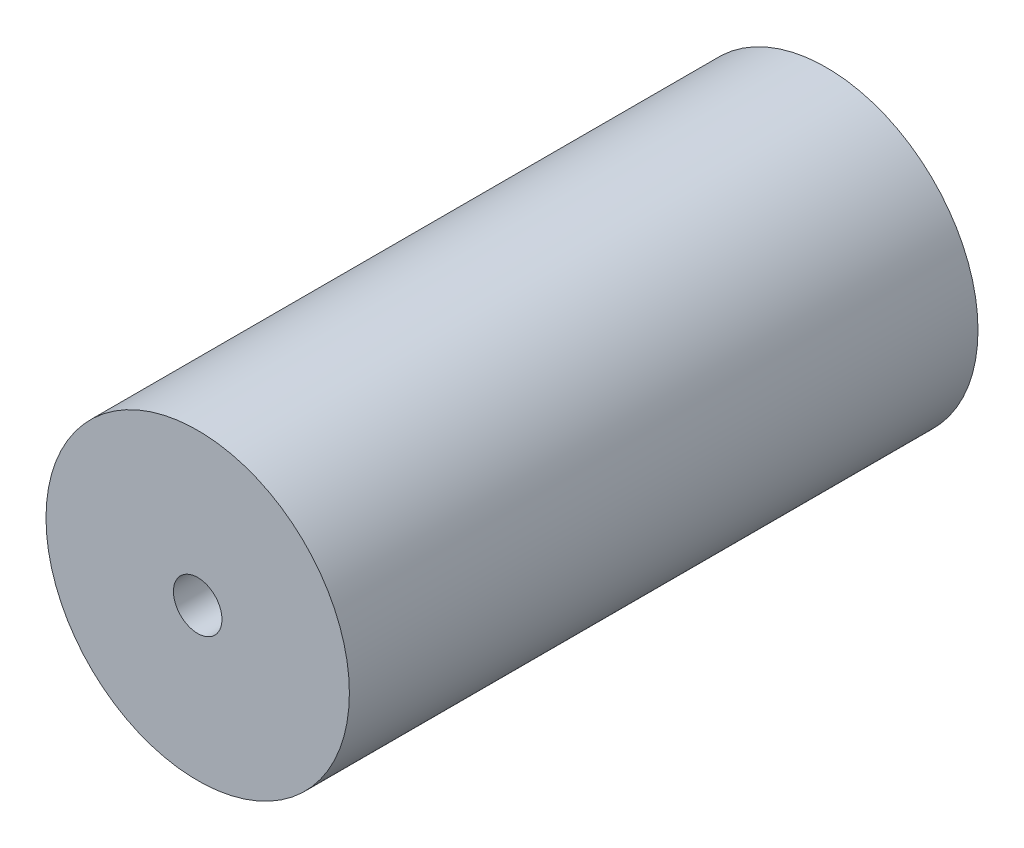
ISO-10303-21;
HEADER;
FILE_DESCRIPTION(('STEP AP214'),'2;1');
FILE_NAME('part.step','',(''),(''),'','','');
FILE_SCHEMA(('AUTOMOTIVE_DESIGN { 1 0 10303 214 1 1 1 1 }'));
ENDSEC;
DATA;
#1=APPLICATION_CONTEXT('core data for automotive mechanical design processes');
#2=APPLICATION_PROTOCOL_DEFINITION('international standard','automotive_design',2000,#1);
#3=PRODUCT_CONTEXT('',#1,'mechanical');
#4=PRODUCT('Part','Part','',(#3));
#5=PRODUCT_RELATED_PRODUCT_CATEGORY('part','',(#4));
#6=PRODUCT_DEFINITION_FORMATION('','',#4);
#7=PRODUCT_DEFINITION_CONTEXT('part definition',#1,'design');
#8=PRODUCT_DEFINITION('design','',#6,#7);
#9=PRODUCT_DEFINITION_SHAPE('','',#8);
#10=(LENGTH_UNIT() NAMED_UNIT(*) SI_UNIT(.MILLI.,.METRE.));
#11=(NAMED_UNIT(*) PLANE_ANGLE_UNIT() SI_UNIT($,.RADIAN.));
#12=(NAMED_UNIT(*) SI_UNIT($,.STERADIAN.) SOLID_ANGLE_UNIT());
#13=UNCERTAINTY_MEASURE_WITH_UNIT(LENGTH_MEASURE(1.E-05),#10,'distance_accuracy_value','');
#14=(GEOMETRIC_REPRESENTATION_CONTEXT(3) GLOBAL_UNCERTAINTY_ASSIGNED_CONTEXT((#13)) GLOBAL_UNIT_ASSIGNED_CONTEXT((#10,
#11,#12)) REPRESENTATION_CONTEXT('',''));
#15=CARTESIAN_POINT('',(0.,0.,0.));
#16=DIRECTION('',(0.,0.,1.));
#17=DIRECTION('',(1.,0.,0.));
#18=AXIS2_PLACEMENT_3D('',#15,#16,#17);
#19=CARTESIAN_POINT('',(0.,0.,51.8));
#20=DIRECTION('',(0.,0.,-1.));
#21=DIRECTION('',(-1.,0.,0.));
#22=AXIS2_PLACEMENT_3D('',#19,#20,#21);
#23=CYLINDRICAL_SURFACE('',#22,12.5);
#24=CARTESIAN_POINT('',(0.,0.,51.8));
#25=DIRECTION('',(0.,0.,1.));
#26=DIRECTION('',(1.,0.,0.));
#27=AXIS2_PLACEMENT_3D('',#24,#25,#26);
#28=CIRCLE('',#27,12.5);
#29=CARTESIAN_POINT('',(-12.5,0.,51.8));
#30=VERTEX_POINT('',#29);
#31=EDGE_CURVE('E50',#30,#30,#28,.T.);
#32=CARTESIAN_POINT('',(0.,0.,0.));
#33=DIRECTION('',(0.,0.,1.));
#34=DIRECTION('',(1.,0.,0.));
#35=AXIS2_PLACEMENT_3D('',#32,#33,#34);
#36=CIRCLE('',#35,12.5);
#37=CARTESIAN_POINT('',(-12.5,0.,0.));
#38=VERTEX_POINT('',#37);
#39=EDGE_CURVE('E46',#38,#38,#36,.T.);
#40=CARTESIAN_POINT('',(-12.5,0.,51.8));
#41=CARTESIAN_POINT('',(-12.5,0.,51.2604166666667));
#42=CARTESIAN_POINT('',(-12.5,0.,50.7208333333333));
#43=CARTESIAN_POINT('',(-12.5,0.,49.6416666666667));
#44=CARTESIAN_POINT('',(-12.5,0.,49.1020833333333));
#45=CARTESIAN_POINT('',(-12.5,0.,48.0229166666667));
#46=CARTESIAN_POINT('',(-12.5,0.,47.4833333333333));
#47=CARTESIAN_POINT('',(-12.5,0.,46.4041666666667));
#48=CARTESIAN_POINT('',(-12.5,0.,45.8645833333333));
#49=CARTESIAN_POINT('',(-12.5,0.,44.7854166666667));
#50=CARTESIAN_POINT('',(-12.5,0.,44.2458333333333));
#51=CARTESIAN_POINT('',(-12.5,0.,43.1666666666667));
#52=CARTESIAN_POINT('',(-12.5,0.,42.6270833333333));
#53=CARTESIAN_POINT('',(-12.5,0.,41.5479166666667));
#54=CARTESIAN_POINT('',(-12.5,0.,41.0083333333333));
#55=CARTESIAN_POINT('',(-12.5,0.,39.9291666666667));
#56=CARTESIAN_POINT('',(-12.5,0.,39.3895833333333));
#57=CARTESIAN_POINT('',(-12.5,0.,38.3104166666667));
#58=CARTESIAN_POINT('',(-12.5,0.,37.7708333333333));
#59=CARTESIAN_POINT('',(-12.5,0.,36.6916666666667));
#60=CARTESIAN_POINT('',(-12.5,0.,36.1520833333333));
#61=CARTESIAN_POINT('',(-12.5,0.,35.0729166666667));
#62=CARTESIAN_POINT('',(-12.5,0.,34.5333333333333));
#63=CARTESIAN_POINT('',(-12.5,0.,33.4541666666667));
#64=CARTESIAN_POINT('',(-12.5,0.,32.9145833333333));
#65=CARTESIAN_POINT('',(-12.5,0.,31.8354166666667));
#66=CARTESIAN_POINT('',(-12.5,0.,31.2958333333333));
#67=CARTESIAN_POINT('',(-12.5,0.,30.2166666666667));
#68=CARTESIAN_POINT('',(-12.5,0.,29.6770833333333));
#69=CARTESIAN_POINT('',(-12.5,0.,28.5979166666667));
#70=CARTESIAN_POINT('',(-12.5,0.,28.0583333333333));
#71=CARTESIAN_POINT('',(-12.5,0.,26.9791666666667));
#72=CARTESIAN_POINT('',(-12.5,0.,26.4395833333333));
#73=CARTESIAN_POINT('',(-12.5,0.,25.3604166666667));
#74=CARTESIAN_POINT('',(-12.5,0.,24.8208333333333));
#75=CARTESIAN_POINT('',(-12.5,0.,23.7416666666667));
#76=CARTESIAN_POINT('',(-12.5,0.,23.2020833333333));
#77=CARTESIAN_POINT('',(-12.5,0.,22.1229166666667));
#78=CARTESIAN_POINT('',(-12.5,0.,21.5833333333333));
#79=CARTESIAN_POINT('',(-12.5,0.,20.5041666666667));
#80=CARTESIAN_POINT('',(-12.5,0.,19.9645833333333));
#81=CARTESIAN_POINT('',(-12.5,0.,18.8854166666667));
#82=CARTESIAN_POINT('',(-12.5,0.,18.3458333333333));
#83=CARTESIAN_POINT('',(-12.5,0.,17.2666666666667));
#84=CARTESIAN_POINT('',(-12.5,0.,16.7270833333333));
#85=CARTESIAN_POINT('',(-12.5,0.,15.6479166666667));
#86=CARTESIAN_POINT('',(-12.5,0.,15.1083333333333));
#87=CARTESIAN_POINT('',(-12.5,0.,14.0291666666667));
#88=CARTESIAN_POINT('',(-12.5,0.,13.4895833333333));
#89=CARTESIAN_POINT('',(-12.5,0.,12.4104166666667));
#90=CARTESIAN_POINT('',(-12.5,0.,11.8708333333333));
#91=CARTESIAN_POINT('',(-12.5,0.,10.7916666666667));
#92=CARTESIAN_POINT('',(-12.5,0.,10.2520833333333));
#93=CARTESIAN_POINT('',(-12.5,0.,9.17291666666666));
#94=CARTESIAN_POINT('',(-12.5,0.,8.63333333333333));
#95=CARTESIAN_POINT('',(-12.5,0.,7.55416666666666));
#96=CARTESIAN_POINT('',(-12.5,0.,7.01458333333333));
#97=CARTESIAN_POINT('',(-12.5,0.,5.93541666666666));
#98=CARTESIAN_POINT('',(-12.5,0.,5.39583333333333));
#99=CARTESIAN_POINT('',(-12.5,0.,4.31666666666666));
#100=CARTESIAN_POINT('',(-12.5,0.,3.77708333333332));
#101=CARTESIAN_POINT('',(-12.5,0.,2.69791666666666));
#102=CARTESIAN_POINT('',(-12.5,0.,2.15833333333333));
#103=CARTESIAN_POINT('',(-12.5,0.,1.07916666666666));
#104=CARTESIAN_POINT('',(-12.5,0.,0.539583333333327));
#105=CARTESIAN_POINT('',(-12.5,0.,0.));
#106=B_SPLINE_CURVE_WITH_KNOTS('',3,(#40,#41,#42,#43,#44,#45,#46,#47,#48,#49,#50,#51,#52,#53,
#54,#55,#56,#57,#58,#59,#60,#61,#62,#63,#64,#65,#66,#67,#68,#69,#70,#71,#72,#73,#74,#75,#76,#77,
#78,#79,#80,#81,#82,#83,#84,#85,#86,#87,#88,#89,#90,#91,#92,#93,#94,#95,#96,#97,#98,#99,#100,
#101,#102,#103,#104,#105),.UNSPECIFIED.,.F.,.F.,(4,2,2,2,2,2,2,2,2,2,2,2,2,2,2,2,2,2,2,2,2,2,2,
2,2,2,2,2,2,2,2,2,4),(0.,1.61875,3.2375,4.85625,6.47499999999999,8.09375,9.71249999999999,
11.33125,12.95,14.56875,16.1875,17.80625,19.425,21.04375,22.6625,24.28125,25.9,27.51875,29.1375,
30.75625,32.375,33.99375,35.6125,37.23125,38.85,40.46875,42.0875,43.70625,45.325,46.94375,
48.5625,50.18125,51.8),.UNSPECIFIED.);
#107=EDGE_CURVE('BSEAM43',#30,#38,#106,.T.);
#108=ORIENTED_EDGE('',*,*,#31,.F.);
#109=ORIENTED_EDGE('',*,*,#39,.T.);
#110=ORIENTED_EDGE('',*,*,#107,.T.);
#111=ORIENTED_EDGE('',*,*,#107,.F.);
#112=EDGE_LOOP('',(#108,#110,#109,#111));
#113=FACE_BOUND('',#112,.T.);
#114=ADVANCED_FACE('F43',(#113),#23,.T.);
#115=CARTESIAN_POINT('',(0.,0.,51.8));
#116=DIRECTION('',(0.,0.,1.));
#117=DIRECTION('',(1.,0.,0.));
#118=AXIS2_PLACEMENT_3D('',#115,#116,#117);
#119=PLANE('',#118);
#120=CARTESIAN_POINT('',(0.,0.,51.8));
#121=DIRECTION('',(0.,0.,-1.));
#122=DIRECTION('',(-1.,0.,0.));
#123=AXIS2_PLACEMENT_3D('',#120,#121,#122);
#124=CIRCLE('',#123,2.);
#125=CARTESIAN_POINT('',(-2.,0.,51.8));
#126=VERTEX_POINT('',#125);
#127=EDGE_CURVE('E64',#126,#126,#124,.T.);
#128=ORIENTED_EDGE('',*,*,#127,.T.);
#129=EDGE_LOOP('',(#128));
#130=FACE_BOUND('',#129,.T.);
#131=ORIENTED_EDGE('',*,*,#31,.T.);
#132=EDGE_LOOP('',(#131));
#133=FACE_BOUND('',#132,.T.);
#134=ADVANCED_FACE('F78',(#130,#133),#119,.T.);
#135=CARTESIAN_POINT('',(0.,0.,0.));
#136=DIRECTION('',(0.,0.,1.));
#137=DIRECTION('',(1.,0.,0.));
#138=AXIS2_PLACEMENT_3D('',#135,#136,#137);
#139=PLANE('',#138);
#140=CARTESIAN_POINT('',(-8.5,0.,0.));
#141=DIRECTION('',(0.,0.,-1.));
#142=DIRECTION('',(-1.,0.,0.));
#143=AXIS2_PLACEMENT_3D('',#140,#141,#142);
#144=CIRCLE('',#143,1.5);
#145=CARTESIAN_POINT('',(-10.,0.,0.));
#146=VERTEX_POINT('',#145);
#147=EDGE_CURVE('E67',#146,#146,#144,.T.);
#148=ORIENTED_EDGE('',*,*,#147,.F.);
#149=EDGE_LOOP('',(#148));
#150=FACE_BOUND('',#149,.T.);
#151=CARTESIAN_POINT('',(8.5,0.,0.));
#152=DIRECTION('',(0.,0.,-1.));
#153=DIRECTION('',(-1.,0.,0.));
#154=AXIS2_PLACEMENT_3D('',#151,#152,#153);
#155=CIRCLE('',#154,1.5);
#156=CARTESIAN_POINT('',(7.,0.,0.));
#157=VERTEX_POINT('',#156);
#158=EDGE_CURVE('E63',#157,#157,#155,.T.);
#159=ORIENTED_EDGE('',*,*,#158,.F.);
#160=EDGE_LOOP('',(#159));
#161=FACE_BOUND('',#160,.T.);
#162=CARTESIAN_POINT('',(0.,0.,0.));
#163=DIRECTION('',(0.,0.,-1.));
#164=DIRECTION('',(-1.,0.,0.));
#165=AXIS2_PLACEMENT_3D('',#162,#163,#164);
#166=CIRCLE('',#165,3.5);
#167=CARTESIAN_POINT('',(-3.5,0.,0.));
#168=VERTEX_POINT('',#167);
#169=EDGE_CURVE('E10',#168,#168,#166,.T.);
#170=ORIENTED_EDGE('',*,*,#169,.F.);
#171=EDGE_LOOP('',(#170));
#172=FACE_BOUND('',#171,.T.);
#173=ORIENTED_EDGE('',*,*,#39,.F.);
#174=EDGE_LOOP('',(#173));
#175=FACE_BOUND('',#174,.T.);
#176=ADVANCED_FACE('F97',(#150,#161,#172,#175),#139,.F.);
#177=CARTESIAN_POINT('',(0.,0.,-2.38));
#178=DIRECTION('',(0.,0.,1.));
#179=DIRECTION('',(1.,0.,0.));
#180=AXIS2_PLACEMENT_3D('',#177,#178,#179);
#181=CYLINDRICAL_SURFACE('',#180,3.5);
#182=CARTESIAN_POINT('',(0.,0.,-2.38));
#183=DIRECTION('',(0.,0.,-1.));
#184=DIRECTION('',(-1.,0.,0.));
#185=AXIS2_PLACEMENT_3D('',#182,#183,#184);
#186=CIRCLE('',#185,3.5);
#187=CARTESIAN_POINT('',(-3.5,0.,-2.38));
#188=VERTEX_POINT('',#187);
#189=EDGE_CURVE('E56',#188,#188,#186,.T.);
#190=ORIENTED_EDGE('',*,*,#189,.F.);
#191=EDGE_LOOP('',(#190));
#192=FACE_BOUND('',#191,.T.);
#193=ORIENTED_EDGE('',*,*,#169,.T.);
#194=EDGE_LOOP('',(#193));
#195=FACE_BOUND('',#194,.T.);
#196=ADVANCED_FACE('F92',(#192,#195),#181,.T.);
#197=CARTESIAN_POINT('',(0.,0.,-2.38));
#198=DIRECTION('',(0.,0.,-1.));
#199=DIRECTION('',(-1.,0.,0.));
#200=AXIS2_PLACEMENT_3D('',#197,#198,#199);
#201=PLANE('',#200);
#202=CARTESIAN_POINT('',(0.,0.,-2.38));
#203=DIRECTION('',(0.,0.,-1.));
#204=DIRECTION('',(-1.,0.,0.));
#205=AXIS2_PLACEMENT_3D('',#202,#203,#204);
#206=CIRCLE('',#205,2.);
#207=CARTESIAN_POINT('',(-2.,0.,-2.38));
#208=VERTEX_POINT('',#207);
#209=EDGE_CURVE('E72',#208,#208,#206,.T.);
#210=ORIENTED_EDGE('',*,*,#209,.F.);
#211=EDGE_LOOP('',(#210));
#212=FACE_BOUND('',#211,.T.);
#213=ORIENTED_EDGE('',*,*,#189,.T.);
#214=EDGE_LOOP('',(#213));
#215=FACE_BOUND('',#214,.T.);
#216=ADVANCED_FACE('F88',(#212,#215),#201,.T.);
#217=CARTESIAN_POINT('',(8.5,0.,5.));
#218=DIRECTION('',(0.,0.,-1.));
#219=DIRECTION('',(-1.,0.,0.));
#220=AXIS2_PLACEMENT_3D('',#217,#218,#219);
#221=CYLINDRICAL_SURFACE('',#220,1.5);
#222=CARTESIAN_POINT('',(8.5,0.,5.));
#223=DIRECTION('',(0.,0.,-1.));
#224=DIRECTION('',(-1.,0.,0.));
#225=AXIS2_PLACEMENT_3D('',#222,#223,#224);
#226=CIRCLE('',#225,1.5);
#227=CARTESIAN_POINT('',(7.,0.,5.));
#228=VERTEX_POINT('',#227);
#229=EDGE_CURVE('E60',#228,#228,#226,.T.);
#230=ORIENTED_EDGE('',*,*,#229,.F.);
#231=EDGE_LOOP('',(#230));
#232=FACE_BOUND('',#231,.T.);
#233=ORIENTED_EDGE('',*,*,#158,.T.);
#234=EDGE_LOOP('',(#233));
#235=FACE_BOUND('',#234,.T.);
#236=ADVANCED_FACE('F91',(#232,#235),#221,.F.);
#237=CARTESIAN_POINT('',(8.5,0.,5.));
#238=DIRECTION('',(0.,0.,-1.));
#239=DIRECTION('',(-1.,0.,0.));
#240=AXIS2_PLACEMENT_3D('',#237,#238,#239);
#241=PLANE('',#240);
#242=ORIENTED_EDGE('',*,*,#229,.T.);
#243=EDGE_LOOP('',(#242));
#244=FACE_BOUND('',#243,.T.);
#245=ADVANCED_FACE('F148',(#244),#241,.T.);
#246=CARTESIAN_POINT('',(-8.5,0.,5.));
#247=DIRECTION('',(0.,0.,-1.));
#248=DIRECTION('',(-1.,0.,0.));
#249=AXIS2_PLACEMENT_3D('',#246,#247,#248);
#250=CYLINDRICAL_SURFACE('',#249,1.5);
#251=CARTESIAN_POINT('',(-8.5,0.,5.));
#252=DIRECTION('',(0.,0.,-1.));
#253=DIRECTION('',(-1.,0.,0.));
#254=AXIS2_PLACEMENT_3D('',#251,#252,#253);
#255=CIRCLE('',#254,1.5);
#256=CARTESIAN_POINT('',(-10.,0.,5.));
#257=VERTEX_POINT('',#256);
#258=EDGE_CURVE('E59',#257,#257,#255,.T.);
#259=ORIENTED_EDGE('',*,*,#258,.F.);
#260=EDGE_LOOP('',(#259));
#261=FACE_BOUND('',#260,.T.);
#262=ORIENTED_EDGE('',*,*,#147,.T.);
#263=EDGE_LOOP('',(#262));
#264=FACE_BOUND('',#263,.T.);
#265=ADVANCED_FACE('F140',(#261,#264),#250,.F.);
#266=CARTESIAN_POINT('',(-8.5,0.,5.));
#267=DIRECTION('',(0.,0.,-1.));
#268=DIRECTION('',(-1.,0.,0.));
#269=AXIS2_PLACEMENT_3D('',#266,#267,#268);
#270=PLANE('',#269);
#271=ORIENTED_EDGE('',*,*,#258,.T.);
#272=EDGE_LOOP('',(#271));
#273=FACE_BOUND('',#272,.T.);
#274=ADVANCED_FACE('F84',(#273),#270,.T.);
#275=CARTESIAN_POINT('',(0.,0.,51.8));
#276=DIRECTION('',(0.,0.,-1.));
#277=DIRECTION('',(-1.,0.,0.));
#278=AXIS2_PLACEMENT_3D('',#275,#276,#277);
#279=CYLINDRICAL_SURFACE('',#278,2.);
#280=CARTESIAN_POINT('',(-2.,0.,51.8));
#281=CARTESIAN_POINT('',(-2.,0.,51.235625));
#282=CARTESIAN_POINT('',(-2.,0.,50.67125));
#283=CARTESIAN_POINT('',(-2.,0.,49.5425));
#284=CARTESIAN_POINT('',(-2.,0.,48.978125));
#285=CARTESIAN_POINT('',(-2.,0.,47.849375));
#286=CARTESIAN_POINT('',(-2.,0.,47.285));
#287=CARTESIAN_POINT('',(-2.,0.,46.15625));
#288=CARTESIAN_POINT('',(-2.,0.,45.591875));
#289=CARTESIAN_POINT('',(-2.,0.,44.463125));
#290=CARTESIAN_POINT('',(-2.,0.,43.89875));
#291=CARTESIAN_POINT('',(-2.,0.,42.77));
#292=CARTESIAN_POINT('',(-2.,0.,42.205625));
#293=CARTESIAN_POINT('',(-2.,0.,41.076875));
#294=CARTESIAN_POINT('',(-2.,0.,40.5125));
#295=CARTESIAN_POINT('',(-2.,0.,39.38375));
#296=CARTESIAN_POINT('',(-2.,0.,38.819375));
#297=CARTESIAN_POINT('',(-2.,0.,37.690625));
#298=CARTESIAN_POINT('',(-2.,0.,37.12625));
#299=CARTESIAN_POINT('',(-2.,0.,35.9975));
#300=CARTESIAN_POINT('',(-2.,0.,35.433125));
#301=CARTESIAN_POINT('',(-2.,0.,34.304375));
#302=CARTESIAN_POINT('',(-2.,0.,33.74));
#303=CARTESIAN_POINT('',(-2.,0.,32.61125));
#304=CARTESIAN_POINT('',(-2.,0.,32.046875));
#305=CARTESIAN_POINT('',(-2.,0.,30.918125));
#306=CARTESIAN_POINT('',(-2.,0.,30.35375));
#307=CARTESIAN_POINT('',(-2.,0.,29.225));
#308=CARTESIAN_POINT('',(-2.,0.,28.660625));
#309=CARTESIAN_POINT('',(-2.,0.,27.531875));
#310=CARTESIAN_POINT('',(-2.,0.,26.9675));
#311=CARTESIAN_POINT('',(-2.,0.,25.83875));
#312=CARTESIAN_POINT('',(-2.,0.,25.274375));
#313=CARTESIAN_POINT('',(-2.,0.,24.145625));
#314=CARTESIAN_POINT('',(-2.,0.,23.58125));
#315=CARTESIAN_POINT('',(-2.,0.,22.4525));
#316=CARTESIAN_POINT('',(-2.,0.,21.888125));
#317=CARTESIAN_POINT('',(-2.,0.,20.759375));
#318=CARTESIAN_POINT('',(-2.,0.,20.195));
#319=CARTESIAN_POINT('',(-2.,0.,19.06625));
#320=CARTESIAN_POINT('',(-2.,0.,18.501875));
#321=CARTESIAN_POINT('',(-2.,0.,17.373125));
#322=CARTESIAN_POINT('',(-2.,0.,16.80875));
#323=CARTESIAN_POINT('',(-2.,0.,15.68));
#324=CARTESIAN_POINT('',(-2.,0.,15.115625));
#325=CARTESIAN_POINT('',(-2.,0.,13.986875));
#326=CARTESIAN_POINT('',(-2.,0.,13.4225));
#327=CARTESIAN_POINT('',(-2.,0.,12.29375));
#328=CARTESIAN_POINT('',(-2.,0.,11.729375));
#329=CARTESIAN_POINT('',(-2.,0.,10.600625));
#330=CARTESIAN_POINT('',(-2.,0.,10.03625));
#331=CARTESIAN_POINT('',(-2.,0.,8.9075));
#332=CARTESIAN_POINT('',(-2.,0.,8.343125));
#333=CARTESIAN_POINT('',(-2.,0.,7.214375));
#334=CARTESIAN_POINT('',(-2.,0.,6.65));
#335=CARTESIAN_POINT('',(-2.,0.,5.52125));
#336=CARTESIAN_POINT('',(-2.,0.,4.956875));
#337=CARTESIAN_POINT('',(-2.,0.,3.828125));
#338=CARTESIAN_POINT('',(-2.,0.,3.26375));
#339=CARTESIAN_POINT('',(-2.,0.,2.135));
#340=CARTESIAN_POINT('',(-2.,0.,1.570625));
#341=CARTESIAN_POINT('',(-2.,0.,0.441875000000002));
#342=CARTESIAN_POINT('',(-2.,0.,-0.122499999999998));
#343=CARTESIAN_POINT('',(-2.,0.,-1.25125));
#344=CARTESIAN_POINT('',(-2.,0.,-1.815625));
#345=CARTESIAN_POINT('',(-2.,0.,-2.38));
#346=B_SPLINE_CURVE_WITH_KNOTS('',3,(#280,#281,#282,#283,#284,#285,#286,#287,#288,#289,#290,
#291,#292,#293,#294,#295,#296,#297,#298,#299,#300,#301,#302,#303,#304,#305,#306,#307,#308,#309,
#310,#311,#312,#313,#314,#315,#316,#317,#318,#319,#320,#321,#322,#323,#324,#325,#326,#327,#328,
#329,#330,#331,#332,#333,#334,#335,#336,#337,#338,#339,#340,#341,#342,#343,#344,#345),
.UNSPECIFIED.,.F.,.F.,(4,2,2,2,2,2,2,2,2,2,2,2,2,2,2,2,2,2,2,2,2,2,2,2,2,2,2,2,2,2,2,2,4),(0.,
1.693125,3.38624999999999,5.079375,6.77249999999999,8.465625,10.15875,11.851875,13.545,
15.238125,16.93125,18.624375,20.3175,22.010625,23.70375,25.396875,27.09,28.783125,30.47625,
32.169375,33.8625,35.555625,37.24875,38.941875,40.635,42.328125,44.02125,45.714375,47.4075,
49.100625,50.79375,52.486875,54.18),.UNSPECIFIED.);
#347=EDGE_CURVE('BSEAM81',#126,#208,#346,.T.);
#348=ORIENTED_EDGE('',*,*,#127,.F.);
#349=ORIENTED_EDGE('',*,*,#209,.T.);
#350=ORIENTED_EDGE('',*,*,#347,.T.);
#351=ORIENTED_EDGE('',*,*,#347,.F.);
#352=EDGE_LOOP('',(#348,#350,#349,#351));
#353=FACE_BOUND('',#352,.T.);
#354=ADVANCED_FACE('F81',(#353),#279,.F.);
#355=CLOSED_SHELL('',(#114,#134,#176,#196,#216,#236,#245,#265,#274,#354));
#356=MANIFOLD_SOLID_BREP('B2',#355);
#357=ADVANCED_BREP_SHAPE_REPRESENTATION('',(#18,#356),#14);
#358=SHAPE_DEFINITION_REPRESENTATION(#9,#357);
ENDSEC;
END-ISO-10303-21;
